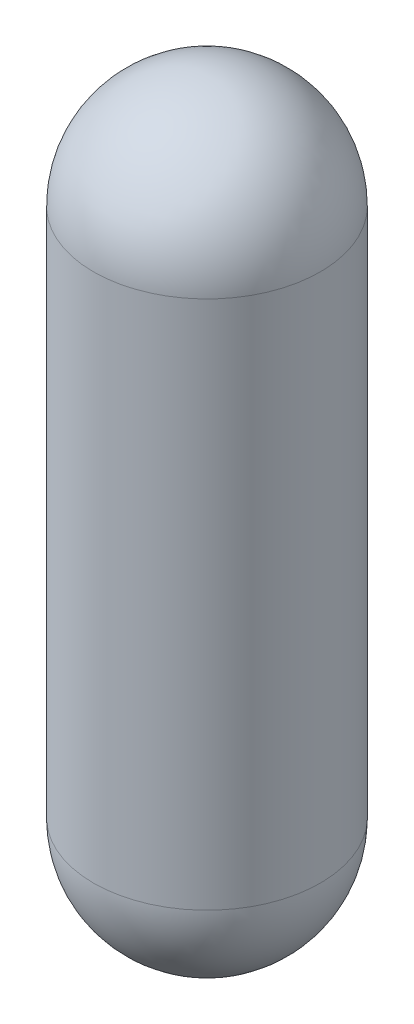
ISO-10303-21;
HEADER;
FILE_DESCRIPTION(('STEP AP214'),'2;1');
FILE_NAME('part.step','',(''),(''),'','','');
FILE_SCHEMA(('AUTOMOTIVE_DESIGN { 1 0 10303 214 1 1 1 1 }'));
ENDSEC;
DATA;
#1=APPLICATION_CONTEXT('core data for automotive mechanical design processes');
#2=APPLICATION_PROTOCOL_DEFINITION('international standard','automotive_design',2000,#1);
#3=PRODUCT_CONTEXT('',#1,'mechanical');
#4=PRODUCT('Part','Part','',(#3));
#5=PRODUCT_RELATED_PRODUCT_CATEGORY('part','',(#4));
#6=PRODUCT_DEFINITION_FORMATION('','',#4);
#7=PRODUCT_DEFINITION_CONTEXT('part definition',#1,'design');
#8=PRODUCT_DEFINITION('design','',#6,#7);
#9=PRODUCT_DEFINITION_SHAPE('','',#8);
#10=(LENGTH_UNIT() NAMED_UNIT(*) SI_UNIT(.MILLI.,.METRE.));
#11=(NAMED_UNIT(*) PLANE_ANGLE_UNIT() SI_UNIT($,.RADIAN.));
#12=(NAMED_UNIT(*) SI_UNIT($,.STERADIAN.) SOLID_ANGLE_UNIT());
#13=UNCERTAINTY_MEASURE_WITH_UNIT(LENGTH_MEASURE(1.E-05),#10,'distance_accuracy_value','');
#14=(GEOMETRIC_REPRESENTATION_CONTEXT(3) GLOBAL_UNCERTAINTY_ASSIGNED_CONTEXT((#13)) GLOBAL_UNIT_ASSIGNED_CONTEXT((#10,
#11,#12)) REPRESENTATION_CONTEXT('',''));
#15=CARTESIAN_POINT('',(0.,0.,0.));
#16=DIRECTION('',(0.,0.,1.));
#17=DIRECTION('',(1.,0.,0.));
#18=AXIS2_PLACEMENT_3D('',#15,#16,#17);
#19=CARTESIAN_POINT('',(110.196823777814,180.196823777814,15.));
#20=DIRECTION('',(0.,-1.,0.));
#21=DIRECTION('',(0.,0.,-1.));
#22=AXIS2_PLACEMENT_3D('',#19,#20,#21);
#23=CYLINDRICAL_SURFACE('',#22,15.);
#24=CARTESIAN_POINT('',(110.196823777814,180.196823777814,15.));
#25=DIRECTION('',(0.,1.,0.));
#26=DIRECTION('',(0.,0.,1.));
#27=AXIS2_PLACEMENT_3D('',#24,#25,#26);
#28=CIRCLE('',#27,15.);
#29=CARTESIAN_POINT('',(110.196823777814,180.196823777814,30.));
#30=VERTEX_POINT('',#29);
#31=EDGE_CURVE('E10',#30,#30,#28,.T.);
#32=ORIENTED_EDGE('',*,*,#31,.F.);
#33=EDGE_LOOP('',(#32));
#34=FACE_BOUND('',#33,.T.);
#35=CARTESIAN_POINT('',(110.196823777814,110.196823777814,15.));
#36=DIRECTION('',(0.,1.,0.));
#37=DIRECTION('',(0.,0.,1.));
#38=AXIS2_PLACEMENT_3D('',#35,#36,#37);
#39=CIRCLE('',#38,15.);
#40=CARTESIAN_POINT('',(110.196823777814,110.196823777814,30.));
#41=VERTEX_POINT('',#40);
#42=EDGE_CURVE('E43',#41,#41,#39,.T.);
#43=ORIENTED_EDGE('',*,*,#42,.T.);
#44=EDGE_LOOP('',(#43));
#45=FACE_BOUND('',#44,.T.);
#46=ADVANCED_FACE('F37',(#34,#45),#23,.T.);
#47=CARTESIAN_POINT('',(110.196823777814,180.196823777814,15.));
#48=DIRECTION('',(0.,0.,-1.));
#49=DIRECTION('',(0.,-1.,0.));
#50=AXIS2_PLACEMENT_3D('',#47,#48,#49);
#51=SPHERICAL_SURFACE('',#50,15.);
#52=CARTESIAN_POINT('',(110.196823777814,180.196823777814,15.));
#53=DIRECTION('',(0.,1.,0.));
#54=DIRECTION('',(0.,0.,1.));
#55=AXIS2_PLACEMENT_3D('',#52,#53,#54);
#56=SPHERICAL_SURFACE('',#55,15.);
#57=ORIENTED_EDGE('',*,*,#31,.T.);
#58=EDGE_LOOP('',(#57));
#59=FACE_BOUND('',#58,.T.);
#60=ADVANCED_FACE('F52',(#59),#56,.T.);
#61=CARTESIAN_POINT('',(110.196823777814,110.196823777814,15.));
#62=DIRECTION('',(0.,0.,1.));
#63=DIRECTION('',(0.,1.,0.));
#64=AXIS2_PLACEMENT_3D('',#61,#62,#63);
#65=SPHERICAL_SURFACE('',#64,15.);
#66=CARTESIAN_POINT('',(110.196823777814,110.196823777814,15.));
#67=DIRECTION('',(0.,1.,0.));
#68=DIRECTION('',(0.,0.,1.));
#69=AXIS2_PLACEMENT_3D('',#66,#67,#68);
#70=SPHERICAL_SURFACE('',#69,15.);
#71=ORIENTED_EDGE('',*,*,#42,.F.);
#72=EDGE_LOOP('',(#71));
#73=FACE_BOUND('',#72,.T.);
#74=ADVANCED_FACE('F50',(#73),#70,.T.);
#75=CLOSED_SHELL('',(#46,#60,#74));
#76=MANIFOLD_SOLID_BREP('B2',#75);
#77=ADVANCED_BREP_SHAPE_REPRESENTATION('',(#18,#76),#14);
#78=SHAPE_DEFINITION_REPRESENTATION(#9,#77);
ENDSEC;
END-ISO-10303-21;
